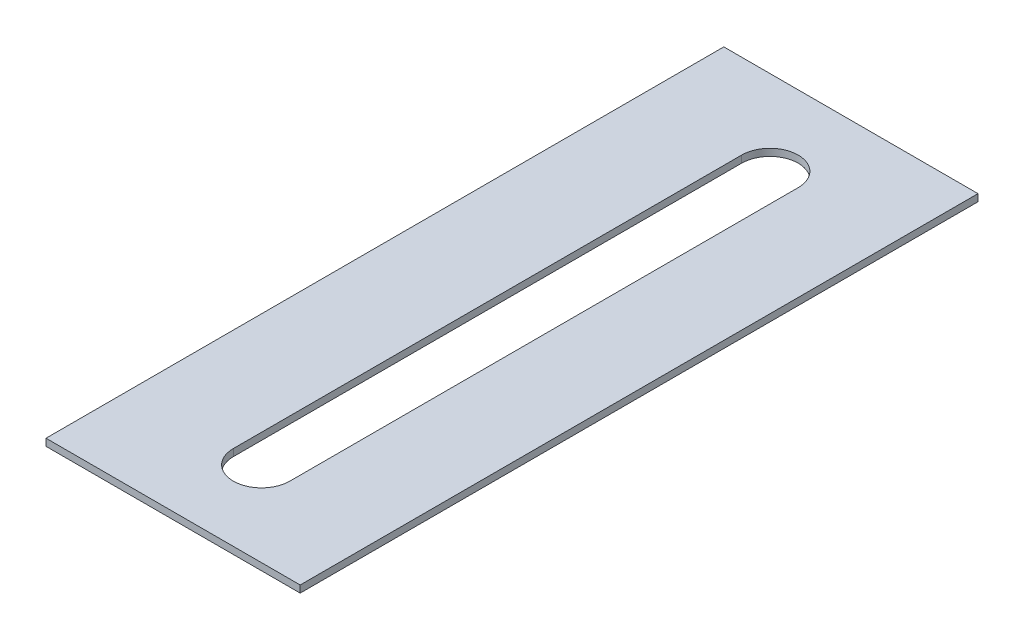
ISO-10303-21;
HEADER;
FILE_DESCRIPTION(('STEP AP214'),'2;1');
FILE_NAME('part.step','',(''),(''),'','','');
FILE_SCHEMA(('AUTOMOTIVE_DESIGN { 1 0 10303 214 1 1 1 1 }'));
ENDSEC;
DATA;
#1=APPLICATION_CONTEXT('core data for automotive mechanical design processes');
#2=APPLICATION_PROTOCOL_DEFINITION('international standard','automotive_design',2000,#1);
#3=PRODUCT_CONTEXT('',#1,'mechanical');
#4=PRODUCT('Part','Part','',(#3));
#5=PRODUCT_RELATED_PRODUCT_CATEGORY('part','',(#4));
#6=PRODUCT_DEFINITION_FORMATION('','',#4);
#7=PRODUCT_DEFINITION_CONTEXT('part definition',#1,'design');
#8=PRODUCT_DEFINITION('design','',#6,#7);
#9=PRODUCT_DEFINITION_SHAPE('','',#8);
#10=(LENGTH_UNIT() NAMED_UNIT(*) SI_UNIT(.MILLI.,.METRE.));
#11=(NAMED_UNIT(*) PLANE_ANGLE_UNIT() SI_UNIT($,.RADIAN.));
#12=(NAMED_UNIT(*) SI_UNIT($,.STERADIAN.) SOLID_ANGLE_UNIT());
#13=UNCERTAINTY_MEASURE_WITH_UNIT(LENGTH_MEASURE(1.E-05),#10,'distance_accuracy_value','');
#14=(GEOMETRIC_REPRESENTATION_CONTEXT(3) GLOBAL_UNCERTAINTY_ASSIGNED_CONTEXT((#13)) GLOBAL_UNIT_ASSIGNED_CONTEXT((#10,
#11,#12)) REPRESENTATION_CONTEXT('',''));
#15=CARTESIAN_POINT('',(0.,0.,0.));
#16=DIRECTION('',(0.,0.,1.));
#17=DIRECTION('',(1.,0.,0.));
#18=AXIS2_PLACEMENT_3D('',#15,#16,#17);
#19=CARTESIAN_POINT('',(0.,6.35,0.));
#20=DIRECTION('',(-1.,0.,0.));
#21=DIRECTION('',(0.,0.,1.));
#22=AXIS2_PLACEMENT_3D('',#19,#20,#21);
#23=PLANE('',#22);
#24=DIRECTION('',(0.,0.,-1.));
#25=VECTOR('',#24,1.);
#26=CARTESIAN_POINT('',(0.,0.,0.));
#27=LINE('',#26,#25);
#28=CARTESIAN_POINT('',(0.,0.,0.));
#29=VERTEX_POINT('',#28);
#30=CARTESIAN_POINT('',(0.,0.,-609.6));
#31=VERTEX_POINT('',#30);
#32=EDGE_CURVE('E130',#29,#31,#27,.T.);
#33=ORIENTED_EDGE('',*,*,#32,.T.);
#34=DIRECTION('',(0.,-1.,0.));
#35=VECTOR('',#34,1.);
#36=CARTESIAN_POINT('',(0.,6.35,-609.6));
#37=LINE('',#36,#35);
#38=CARTESIAN_POINT('',(0.,6.35,-609.6));
#39=VERTEX_POINT('',#38);
#40=EDGE_CURVE('E11',#39,#31,#37,.T.);
#41=ORIENTED_EDGE('',*,*,#40,.F.);
#42=DIRECTION('',(0.,0.,-1.));
#43=VECTOR('',#42,1.);
#44=CARTESIAN_POINT('',(0.,6.35,0.));
#45=LINE('',#44,#43);
#46=CARTESIAN_POINT('',(0.,6.35,0.));
#47=VERTEX_POINT('',#46);
#48=EDGE_CURVE('E134',#47,#39,#45,.T.);
#49=ORIENTED_EDGE('',*,*,#48,.F.);
#50=DIRECTION('',(0.,-1.,0.));
#51=VECTOR('',#50,1.);
#52=CARTESIAN_POINT('',(0.,6.35,0.));
#53=LINE('',#52,#51);
#54=EDGE_CURVE('E144',#47,#29,#53,.T.);
#55=ORIENTED_EDGE('',*,*,#54,.T.);
#56=EDGE_LOOP('',(#33,#41,#49,#55));
#57=FACE_BOUND('',#56,.T.);
#58=ADVANCED_FACE('F33',(#57),#23,.F.);
#59=CARTESIAN_POINT('',(0.,6.35,-609.6));
#60=DIRECTION('',(0.,0.,1.));
#61=DIRECTION('',(1.,0.,0.));
#62=AXIS2_PLACEMENT_3D('',#59,#60,#61);
#63=PLANE('',#62);
#64=DIRECTION('',(-1.,0.,0.));
#65=VECTOR('',#64,1.);
#66=CARTESIAN_POINT('',(0.,0.,-609.6));
#67=LINE('',#66,#65);
#68=CARTESIAN_POINT('',(-228.6,0.,-609.6));
#69=VERTEX_POINT('',#68);
#70=EDGE_CURVE('E147',#31,#69,#67,.T.);
#71=ORIENTED_EDGE('',*,*,#70,.T.);
#72=DIRECTION('',(0.,-1.,0.));
#73=VECTOR('',#72,1.);
#74=CARTESIAN_POINT('',(-228.6,6.35,-609.6));
#75=LINE('',#74,#73);
#76=CARTESIAN_POINT('',(-228.6,6.35,-609.6));
#77=VERTEX_POINT('',#76);
#78=EDGE_CURVE('E40',#77,#69,#75,.T.);
#79=ORIENTED_EDGE('',*,*,#78,.F.);
#80=DIRECTION('',(-1.,0.,0.));
#81=VECTOR('',#80,1.);
#82=CARTESIAN_POINT('',(0.,6.35,-609.6));
#83=LINE('',#82,#81);
#84=EDGE_CURVE('E137',#39,#77,#83,.T.);
#85=ORIENTED_EDGE('',*,*,#84,.F.);
#86=ORIENTED_EDGE('',*,*,#40,.T.);
#87=EDGE_LOOP('',(#71,#79,#85,#86));
#88=FACE_BOUND('',#87,.T.);
#89=ADVANCED_FACE('F175',(#88),#63,.F.);
#90=CARTESIAN_POINT('',(-228.6,6.35,0.));
#91=DIRECTION('',(1.,0.,0.));
#92=DIRECTION('',(0.,0.,-1.));
#93=AXIS2_PLACEMENT_3D('',#90,#91,#92);
#94=PLANE('',#93);
#95=DIRECTION('',(0.,0.,1.));
#96=VECTOR('',#95,1.);
#97=CARTESIAN_POINT('',(-228.6,0.,0.));
#98=LINE('',#97,#96);
#99=CARTESIAN_POINT('',(-228.6,0.,0.));
#100=VERTEX_POINT('',#99);
#101=EDGE_CURVE('E149',#69,#100,#98,.T.);
#102=ORIENTED_EDGE('',*,*,#101,.T.);
#103=DIRECTION('',(0.,-1.,0.));
#104=VECTOR('',#103,1.);
#105=CARTESIAN_POINT('',(-228.6,6.35,0.));
#106=LINE('',#105,#104);
#107=CARTESIAN_POINT('',(-228.6,6.35,0.));
#108=VERTEX_POINT('',#107);
#109=EDGE_CURVE('E154',#108,#100,#106,.T.);
#110=ORIENTED_EDGE('',*,*,#109,.F.);
#111=DIRECTION('',(0.,0.,1.));
#112=VECTOR('',#111,1.);
#113=CARTESIAN_POINT('',(-228.6,6.35,0.));
#114=LINE('',#113,#112);
#115=EDGE_CURVE('E140',#77,#108,#114,.T.);
#116=ORIENTED_EDGE('',*,*,#115,.F.);
#117=ORIENTED_EDGE('',*,*,#78,.T.);
#118=EDGE_LOOP('',(#102,#110,#116,#117));
#119=FACE_BOUND('',#118,.T.);
#120=ADVANCED_FACE('F161',(#119),#94,.F.);
#121=CARTESIAN_POINT('',(0.,6.35,0.));
#122=DIRECTION('',(0.,0.,-1.));
#123=DIRECTION('',(-1.,0.,0.));
#124=AXIS2_PLACEMENT_3D('',#121,#122,#123);
#125=PLANE('',#124);
#126=DIRECTION('',(1.,0.,0.));
#127=VECTOR('',#126,1.);
#128=CARTESIAN_POINT('',(0.,0.,0.));
#129=LINE('',#128,#127);
#130=EDGE_CURVE('E138',#100,#29,#129,.T.);
#131=ORIENTED_EDGE('',*,*,#130,.T.);
#132=ORIENTED_EDGE('',*,*,#54,.F.);
#133=DIRECTION('',(1.,0.,0.));
#134=VECTOR('',#133,1.);
#135=CARTESIAN_POINT('',(0.,6.35,0.));
#136=LINE('',#135,#134);
#137=EDGE_CURVE('E142',#108,#47,#136,.T.);
#138=ORIENTED_EDGE('',*,*,#137,.F.);
#139=ORIENTED_EDGE('',*,*,#109,.T.);
#140=EDGE_LOOP('',(#131,#132,#138,#139));
#141=FACE_BOUND('',#140,.T.);
#142=ADVANCED_FACE('F168',(#141),#125,.F.);
#143=CARTESIAN_POINT('',(0.,6.35,0.));
#144=DIRECTION('',(0.,1.,0.));
#145=DIRECTION('',(0.,0.,1.));
#146=AXIS2_PLACEMENT_3D('',#143,#144,#145);
#147=PLANE('',#146);
#148=CARTESIAN_POINT('',(-110.927361064197,6.35,-76.2));
#149=DIRECTION('',(0.,1.,0.));
#150=DIRECTION('',(0.,0.,1.));
#151=AXIS2_PLACEMENT_3D('',#148,#149,#150);
#152=CIRCLE('',#151,25.4000000000001);
#153=CARTESIAN_POINT('',(-136.327361064197,6.35,-76.2));
#154=VERTEX_POINT('',#153);
#155=CARTESIAN_POINT('',(-85.5273610641969,6.35,-76.2));
#156=VERTEX_POINT('',#155);
#157=EDGE_CURVE('E47',#154,#156,#152,.T.);
#158=ORIENTED_EDGE('',*,*,#157,.F.);
#159=DIRECTION('',(0.,0.,-1.));
#160=VECTOR('',#159,1.);
#161=CARTESIAN_POINT('',(-136.327361064197,6.35,-76.2));
#162=LINE('',#161,#160);
#163=CARTESIAN_POINT('',(-136.327361064197,6.35,-533.4));
#164=VERTEX_POINT('',#163);
#165=EDGE_CURVE('E115',#154,#164,#162,.T.);
#166=ORIENTED_EDGE('',*,*,#165,.T.);
#167=CARTESIAN_POINT('',(-110.927361064197,6.35,-533.4));
#168=DIRECTION('',(0.,1.,0.));
#169=DIRECTION('',(0.,0.,1.));
#170=AXIS2_PLACEMENT_3D('',#167,#168,#169);
#171=CIRCLE('',#170,25.4000000000001);
#172=CARTESIAN_POINT('',(-85.527361064197,6.35,-533.4));
#173=VERTEX_POINT('',#172);
#174=EDGE_CURVE('E118',#173,#164,#171,.T.);
#175=ORIENTED_EDGE('',*,*,#174,.F.);
#176=DIRECTION('',(0.,0.,-1.));
#177=VECTOR('',#176,1.);
#178=CARTESIAN_POINT('',(-85.5273610641969,6.35,-76.2));
#179=LINE('',#178,#177);
#180=EDGE_CURVE('E124',#156,#173,#179,.T.);
#181=ORIENTED_EDGE('',*,*,#180,.F.);
#182=EDGE_LOOP('',(#158,#166,#175,#181));
#183=FACE_BOUND('',#182,.T.);
#184=ORIENTED_EDGE('',*,*,#48,.T.);
#185=ORIENTED_EDGE('',*,*,#84,.T.);
#186=ORIENTED_EDGE('',*,*,#115,.T.);
#187=ORIENTED_EDGE('',*,*,#137,.T.);
#188=EDGE_LOOP('',(#184,#185,#186,#187));
#189=FACE_BOUND('',#188,.T.);
#190=ADVANCED_FACE('F174',(#183,#189),#147,.T.);
#191=CARTESIAN_POINT('',(0.,0.,0.));
#192=DIRECTION('',(0.,1.,0.));
#193=DIRECTION('',(0.,0.,1.));
#194=AXIS2_PLACEMENT_3D('',#191,#192,#193);
#195=PLANE('',#194);
#196=DIRECTION('',(0.,0.,-1.));
#197=VECTOR('',#196,1.);
#198=CARTESIAN_POINT('',(-136.327361064197,0.,-76.2));
#199=LINE('',#198,#197);
#200=CARTESIAN_POINT('',(-136.327361064197,0.,-76.2));
#201=VERTEX_POINT('',#200);
#202=CARTESIAN_POINT('',(-136.327361064197,0.,-533.4));
#203=VERTEX_POINT('',#202);
#204=EDGE_CURVE('E106',#201,#203,#199,.T.);
#205=ORIENTED_EDGE('',*,*,#204,.F.);
#206=CARTESIAN_POINT('',(-110.927361064197,0.,-76.2));
#207=DIRECTION('',(0.,1.,0.));
#208=DIRECTION('',(0.,0.,1.));
#209=AXIS2_PLACEMENT_3D('',#206,#207,#208);
#210=CIRCLE('',#209,25.4000000000001);
#211=CARTESIAN_POINT('',(-85.5273610641969,0.,-76.2));
#212=VERTEX_POINT('',#211);
#213=EDGE_CURVE('E100',#201,#212,#210,.T.);
#214=ORIENTED_EDGE('',*,*,#213,.T.);
#215=DIRECTION('',(0.,0.,-1.));
#216=VECTOR('',#215,1.);
#217=CARTESIAN_POINT('',(-85.5273610641969,0.,-76.2));
#218=LINE('',#217,#216);
#219=CARTESIAN_POINT('',(-85.527361064197,0.,-533.4));
#220=VERTEX_POINT('',#219);
#221=EDGE_CURVE('E109',#212,#220,#218,.T.);
#222=ORIENTED_EDGE('',*,*,#221,.T.);
#223=CARTESIAN_POINT('',(-110.927361064197,0.,-533.4));
#224=DIRECTION('',(0.,1.,0.));
#225=DIRECTION('',(0.,0.,1.));
#226=AXIS2_PLACEMENT_3D('',#223,#224,#225);
#227=CIRCLE('',#226,25.4000000000001);
#228=EDGE_CURVE('E55',#220,#203,#227,.T.);
#229=ORIENTED_EDGE('',*,*,#228,.T.);
#230=EDGE_LOOP('',(#205,#214,#222,#229));
#231=FACE_BOUND('',#230,.T.);
#232=ORIENTED_EDGE('',*,*,#32,.F.);
#233=ORIENTED_EDGE('',*,*,#130,.F.);
#234=ORIENTED_EDGE('',*,*,#101,.F.);
#235=ORIENTED_EDGE('',*,*,#70,.F.);
#236=EDGE_LOOP('',(#232,#233,#234,#235));
#237=FACE_BOUND('',#236,.T.);
#238=ADVANCED_FACE('F113',(#231,#237),#195,.F.);
#239=CARTESIAN_POINT('',(-110.927361064197,0.,-76.2));
#240=DIRECTION('',(0.,1.,0.));
#241=DIRECTION('',(0.,0.,1.));
#242=AXIS2_PLACEMENT_3D('',#239,#240,#241);
#243=CYLINDRICAL_SURFACE('',#242,25.4000000000001);
#244=ORIENTED_EDGE('',*,*,#157,.T.);
#245=DIRECTION('',(0.,1.,0.));
#246=VECTOR('',#245,1.);
#247=CARTESIAN_POINT('',(-85.5273610641969,0.,-76.2));
#248=LINE('',#247,#246);
#249=EDGE_CURVE('E96',#212,#156,#248,.T.);
#250=ORIENTED_EDGE('',*,*,#249,.F.);
#251=ORIENTED_EDGE('',*,*,#213,.F.);
#252=DIRECTION('',(0.,1.,0.));
#253=VECTOR('',#252,1.);
#254=CARTESIAN_POINT('',(-136.327361064197,0.,-76.2));
#255=LINE('',#254,#253);
#256=EDGE_CURVE('E128',#201,#154,#255,.T.);
#257=ORIENTED_EDGE('',*,*,#256,.T.);
#258=EDGE_LOOP('',(#244,#250,#251,#257));
#259=FACE_BOUND('',#258,.T.);
#260=ADVANCED_FACE('F98',(#259),#243,.F.);
#261=CARTESIAN_POINT('',(-136.327361064197,0.,-76.2));
#262=DIRECTION('',(1.,0.,0.));
#263=DIRECTION('',(0.,0.,-1.));
#264=AXIS2_PLACEMENT_3D('',#261,#262,#263);
#265=PLANE('',#264);
#266=ORIENTED_EDGE('',*,*,#165,.F.);
#267=ORIENTED_EDGE('',*,*,#256,.F.);
#268=ORIENTED_EDGE('',*,*,#204,.T.);
#269=DIRECTION('',(0.,1.,0.));
#270=VECTOR('',#269,1.);
#271=CARTESIAN_POINT('',(-136.327361064197,0.,-533.4));
#272=LINE('',#271,#270);
#273=EDGE_CURVE('E131',#203,#164,#272,.T.);
#274=ORIENTED_EDGE('',*,*,#273,.T.);
#275=EDGE_LOOP('',(#266,#267,#268,#274));
#276=FACE_BOUND('',#275,.T.);
#277=ADVANCED_FACE('F192',(#276),#265,.T.);
#278=CARTESIAN_POINT('',(-110.927361064197,0.,-533.4));
#279=DIRECTION('',(0.,1.,0.));
#280=DIRECTION('',(0.,0.,1.));
#281=AXIS2_PLACEMENT_3D('',#278,#279,#280);
#282=CYLINDRICAL_SURFACE('',#281,25.4000000000001);
#283=ORIENTED_EDGE('',*,*,#174,.T.);
#284=ORIENTED_EDGE('',*,*,#273,.F.);
#285=ORIENTED_EDGE('',*,*,#228,.F.);
#286=DIRECTION('',(0.,1.,0.));
#287=VECTOR('',#286,1.);
#288=CARTESIAN_POINT('',(-85.527361064197,0.,-533.4));
#289=LINE('',#288,#287);
#290=EDGE_CURVE('E105',#220,#173,#289,.T.);
#291=ORIENTED_EDGE('',*,*,#290,.T.);
#292=EDGE_LOOP('',(#283,#284,#285,#291));
#293=FACE_BOUND('',#292,.T.);
#294=ADVANCED_FACE('F195',(#293),#282,.F.);
#295=CARTESIAN_POINT('',(-85.5273610641969,0.,-76.2));
#296=DIRECTION('',(1.,0.,0.));
#297=DIRECTION('',(0.,0.,-1.));
#298=AXIS2_PLACEMENT_3D('',#295,#296,#297);
#299=PLANE('',#298);
#300=ORIENTED_EDGE('',*,*,#180,.T.);
#301=ORIENTED_EDGE('',*,*,#290,.F.);
#302=ORIENTED_EDGE('',*,*,#221,.F.);
#303=ORIENTED_EDGE('',*,*,#249,.T.);
#304=EDGE_LOOP('',(#300,#301,#302,#303));
#305=FACE_BOUND('',#304,.T.);
#306=ADVANCED_FACE('F110',(#305),#299,.F.);
#307=CLOSED_SHELL('',(#58,#89,#120,#142,#190,#238,#260,#277,#294,#306));
#308=MANIFOLD_SOLID_BREP('B2',#307);
#309=ADVANCED_BREP_SHAPE_REPRESENTATION('',(#18,#308),#14);
#310=SHAPE_DEFINITION_REPRESENTATION(#9,#309);
ENDSEC;
END-ISO-10303-21;
